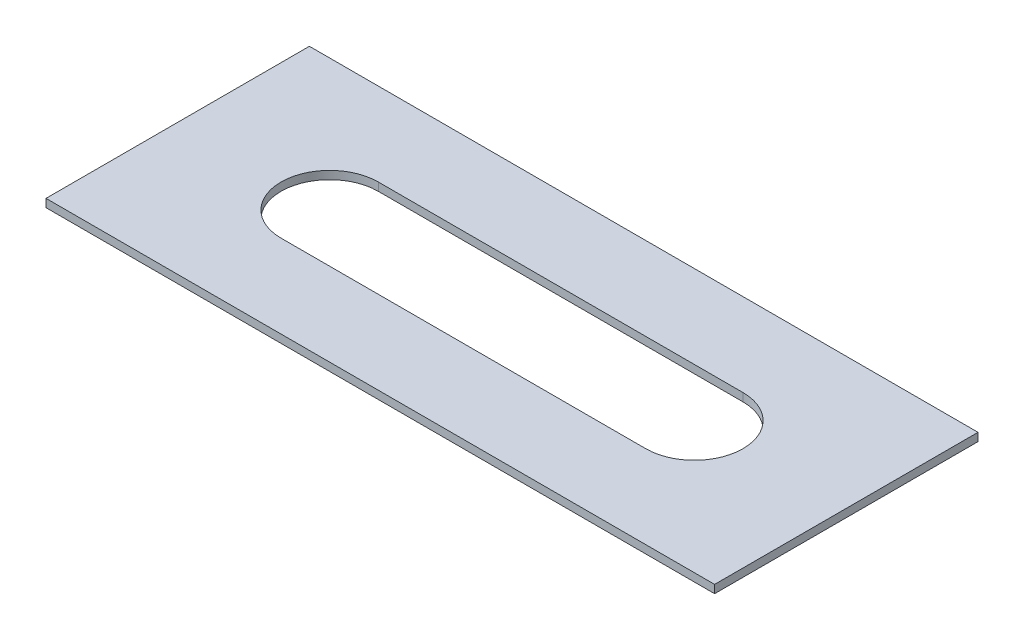
ISO-10303-21;
HEADER;
FILE_DESCRIPTION(('STEP AP214'),'2;1');
FILE_NAME('part.step','',(''),(''),'','','');
FILE_SCHEMA(('AUTOMOTIVE_DESIGN { 1 0 10303 214 1 1 1 1 }'));
ENDSEC;
DATA;
#1=APPLICATION_CONTEXT('core data for automotive mechanical design processes');
#2=APPLICATION_PROTOCOL_DEFINITION('international standard','automotive_design',2000,#1);
#3=PRODUCT_CONTEXT('',#1,'mechanical');
#4=PRODUCT('Part','Part','',(#3));
#5=PRODUCT_RELATED_PRODUCT_CATEGORY('part','',(#4));
#6=PRODUCT_DEFINITION_FORMATION('','',#4);
#7=PRODUCT_DEFINITION_CONTEXT('part definition',#1,'design');
#8=PRODUCT_DEFINITION('design','',#6,#7);
#9=PRODUCT_DEFINITION_SHAPE('','',#8);
#10=(LENGTH_UNIT() NAMED_UNIT(*) SI_UNIT(.MILLI.,.METRE.));
#11=(NAMED_UNIT(*) PLANE_ANGLE_UNIT() SI_UNIT($,.RADIAN.));
#12=(NAMED_UNIT(*) SI_UNIT($,.STERADIAN.) SOLID_ANGLE_UNIT());
#13=UNCERTAINTY_MEASURE_WITH_UNIT(LENGTH_MEASURE(1.E-05),#10,'distance_accuracy_value','');
#14=(GEOMETRIC_REPRESENTATION_CONTEXT(3) GLOBAL_UNCERTAINTY_ASSIGNED_CONTEXT((#13)) GLOBAL_UNIT_ASSIGNED_CONTEXT((#10,
#11,#12)) REPRESENTATION_CONTEXT('',''));
#15=CARTESIAN_POINT('',(0.,0.,0.));
#16=DIRECTION('',(0.,0.,1.));
#17=DIRECTION('',(1.,0.,0.));
#18=AXIS2_PLACEMENT_3D('',#15,#16,#17);
#19=CARTESIAN_POINT('',(0.,2.,0.));
#20=DIRECTION('',(0.,-1.,0.));
#21=DIRECTION('',(0.,0.,-1.));
#22=AXIS2_PLACEMENT_3D('',#19,#20,#21);
#23=PLANE('',#22);
#24=DIRECTION('',(0.,0.,1.));
#25=VECTOR('',#24,1.);
#26=CARTESIAN_POINT('',(0.,2.,0.));
#27=LINE('',#26,#25);
#28=CARTESIAN_POINT('',(0.,2.,-65.));
#29=VERTEX_POINT('',#28);
#30=CARTESIAN_POINT('',(0.,2.,0.));
#31=VERTEX_POINT('',#30);
#32=EDGE_CURVE('E138',#29,#31,#27,.T.);
#33=ORIENTED_EDGE('',*,*,#32,.T.);
#34=DIRECTION('',(1.,0.,0.));
#35=VECTOR('',#34,1.);
#36=CARTESIAN_POINT('',(0.,2.,0.));
#37=LINE('',#36,#35);
#38=CARTESIAN_POINT('',(165.,2.,0.));
#39=VERTEX_POINT('',#38);
#40=EDGE_CURVE('E141',#31,#39,#37,.T.);
#41=ORIENTED_EDGE('',*,*,#40,.T.);
#42=DIRECTION('',(0.,0.,-1.));
#43=VECTOR('',#42,1.);
#44=CARTESIAN_POINT('',(165.,2.,0.));
#45=LINE('',#44,#43);
#46=CARTESIAN_POINT('',(165.,2.,-65.));
#47=VERTEX_POINT('',#46);
#48=EDGE_CURVE('E144',#39,#47,#45,.T.);
#49=ORIENTED_EDGE('',*,*,#48,.T.);
#50=DIRECTION('',(-1.,0.,0.));
#51=VECTOR('',#50,1.);
#52=CARTESIAN_POINT('',(0.,2.,-65.));
#53=LINE('',#52,#51);
#54=EDGE_CURVE('E146',#47,#29,#53,.T.);
#55=ORIENTED_EDGE('',*,*,#54,.T.);
#56=EDGE_LOOP('',(#33,#41,#49,#55));
#57=FACE_BOUND('',#56,.T.);
#58=CARTESIAN_POINT('',(37.5,2.,-32.5));
#59=DIRECTION('',(0.,1.,0.));
#60=DIRECTION('',(0.,0.,1.));
#61=AXIS2_PLACEMENT_3D('',#58,#59,#60);
#62=CIRCLE('',#61,12.);
#63=CARTESIAN_POINT('',(37.5,2.,-44.5));
#64=VERTEX_POINT('',#63);
#65=CARTESIAN_POINT('',(37.5,2.,-20.5));
#66=VERTEX_POINT('',#65);
#67=EDGE_CURVE('E102',#64,#66,#62,.T.);
#68=ORIENTED_EDGE('',*,*,#67,.F.);
#69=DIRECTION('',(-1.,0.,0.));
#70=VECTOR('',#69,1.);
#71=CARTESIAN_POINT('',(37.5,2.,-44.5));
#72=LINE('',#71,#70);
#73=CARTESIAN_POINT('',(127.5,2.,-44.5));
#74=VERTEX_POINT('',#73);
#75=EDGE_CURVE('E124',#74,#64,#72,.T.);
#76=ORIENTED_EDGE('',*,*,#75,.F.);
#77=CARTESIAN_POINT('',(127.5,2.,-32.5));
#78=DIRECTION('',(0.,1.,0.));
#79=DIRECTION('',(0.,0.,1.));
#80=AXIS2_PLACEMENT_3D('',#77,#78,#79);
#81=CIRCLE('',#80,12.);
#82=CARTESIAN_POINT('',(127.5,2.,-20.5));
#83=VERTEX_POINT('',#82);
#84=EDGE_CURVE('E122',#83,#74,#81,.T.);
#85=ORIENTED_EDGE('',*,*,#84,.F.);
#86=DIRECTION('',(1.,0.,0.));
#87=VECTOR('',#86,1.);
#88=CARTESIAN_POINT('',(37.5,2.,-20.5));
#89=LINE('',#88,#87);
#90=EDGE_CURVE('E110',#66,#83,#89,.T.);
#91=ORIENTED_EDGE('',*,*,#90,.F.);
#92=EDGE_LOOP('',(#68,#76,#85,#91));
#93=FACE_BOUND('',#92,.T.);
#94=ADVANCED_FACE('F37',(#57,#93),#23,.F.);
#95=CARTESIAN_POINT('',(0.,0.,0.));
#96=DIRECTION('',(0.,-1.,0.));
#97=DIRECTION('',(0.,0.,-1.));
#98=AXIS2_PLACEMENT_3D('',#95,#96,#97);
#99=PLANE('',#98);
#100=DIRECTION('',(0.,0.,1.));
#101=VECTOR('',#100,1.);
#102=CARTESIAN_POINT('',(0.,0.,0.));
#103=LINE('',#102,#101);
#104=CARTESIAN_POINT('',(0.,0.,-65.));
#105=VERTEX_POINT('',#104);
#106=CARTESIAN_POINT('',(0.,0.,0.));
#107=VERTEX_POINT('',#106);
#108=EDGE_CURVE('E118',#105,#107,#103,.T.);
#109=ORIENTED_EDGE('',*,*,#108,.F.);
#110=DIRECTION('',(-1.,0.,0.));
#111=VECTOR('',#110,1.);
#112=CARTESIAN_POINT('',(0.,0.,-65.));
#113=LINE('',#112,#111);
#114=CARTESIAN_POINT('',(165.,0.,-65.));
#115=VERTEX_POINT('',#114);
#116=EDGE_CURVE('E142',#115,#105,#113,.T.);
#117=ORIENTED_EDGE('',*,*,#116,.F.);
#118=DIRECTION('',(0.,0.,-1.));
#119=VECTOR('',#118,1.);
#120=CARTESIAN_POINT('',(165.,0.,0.));
#121=LINE('',#120,#119);
#122=CARTESIAN_POINT('',(165.,0.,0.));
#123=VERTEX_POINT('',#122);
#124=EDGE_CURVE('E153',#123,#115,#121,.T.);
#125=ORIENTED_EDGE('',*,*,#124,.F.);
#126=DIRECTION('',(1.,0.,0.));
#127=VECTOR('',#126,1.);
#128=CARTESIAN_POINT('',(0.,0.,0.));
#129=LINE('',#128,#127);
#130=EDGE_CURVE('E151',#107,#123,#129,.T.);
#131=ORIENTED_EDGE('',*,*,#130,.F.);
#132=EDGE_LOOP('',(#109,#117,#125,#131));
#133=FACE_BOUND('',#132,.T.);
#134=DIRECTION('',(-1.,0.,0.));
#135=VECTOR('',#134,1.);
#136=CARTESIAN_POINT('',(37.5,0.,-44.5));
#137=LINE('',#136,#135);
#138=CARTESIAN_POINT('',(127.5,0.,-44.5));
#139=VERTEX_POINT('',#138);
#140=CARTESIAN_POINT('',(37.5,0.,-44.5));
#141=VERTEX_POINT('',#140);
#142=EDGE_CURVE('E111',#139,#141,#137,.T.);
#143=ORIENTED_EDGE('',*,*,#142,.T.);
#144=CARTESIAN_POINT('',(37.5,0.,-32.5));
#145=DIRECTION('',(0.,1.,0.));
#146=DIRECTION('',(0.,0.,1.));
#147=AXIS2_PLACEMENT_3D('',#144,#145,#146);
#148=CIRCLE('',#147,12.);
#149=CARTESIAN_POINT('',(37.5,0.,-20.5));
#150=VERTEX_POINT('',#149);
#151=EDGE_CURVE('E60',#141,#150,#148,.T.);
#152=ORIENTED_EDGE('',*,*,#151,.T.);
#153=DIRECTION('',(1.,0.,0.));
#154=VECTOR('',#153,1.);
#155=CARTESIAN_POINT('',(37.5,0.,-20.5));
#156=LINE('',#155,#154);
#157=CARTESIAN_POINT('',(127.5,0.,-20.5));
#158=VERTEX_POINT('',#157);
#159=EDGE_CURVE('E117',#150,#158,#156,.T.);
#160=ORIENTED_EDGE('',*,*,#159,.T.);
#161=CARTESIAN_POINT('',(127.5,0.,-32.5));
#162=DIRECTION('',(0.,1.,0.));
#163=DIRECTION('',(0.,0.,1.));
#164=AXIS2_PLACEMENT_3D('',#161,#162,#163);
#165=CIRCLE('',#164,12.);
#166=EDGE_CURVE('E130',#158,#139,#165,.T.);
#167=ORIENTED_EDGE('',*,*,#166,.T.);
#168=EDGE_LOOP('',(#143,#152,#160,#167));
#169=FACE_BOUND('',#168,.T.);
#170=ADVANCED_FACE('F171',(#133,#169),#99,.T.);
#171=CARTESIAN_POINT('',(0.,2.,0.));
#172=DIRECTION('',(1.,0.,0.));
#173=DIRECTION('',(0.,0.,-1.));
#174=AXIS2_PLACEMENT_3D('',#171,#172,#173);
#175=PLANE('',#174);
#176=ORIENTED_EDGE('',*,*,#108,.T.);
#177=DIRECTION('',(0.,-1.,0.));
#178=VECTOR('',#177,1.);
#179=CARTESIAN_POINT('',(0.,2.,0.));
#180=LINE('',#179,#178);
#181=EDGE_CURVE('E11',#31,#107,#180,.T.);
#182=ORIENTED_EDGE('',*,*,#181,.F.);
#183=ORIENTED_EDGE('',*,*,#32,.F.);
#184=DIRECTION('',(0.,-1.,0.));
#185=VECTOR('',#184,1.);
#186=CARTESIAN_POINT('',(0.,2.,-65.));
#187=LINE('',#186,#185);
#188=EDGE_CURVE('E148',#29,#105,#187,.T.);
#189=ORIENTED_EDGE('',*,*,#188,.T.);
#190=EDGE_LOOP('',(#176,#182,#183,#189));
#191=FACE_BOUND('',#190,.T.);
#192=ADVANCED_FACE('F39',(#191),#175,.F.);
#193=CARTESIAN_POINT('',(0.,2.,0.));
#194=DIRECTION('',(0.,0.,-1.));
#195=DIRECTION('',(-1.,0.,0.));
#196=AXIS2_PLACEMENT_3D('',#193,#194,#195);
#197=PLANE('',#196);
#198=ORIENTED_EDGE('',*,*,#130,.T.);
#199=DIRECTION('',(0.,-1.,0.));
#200=VECTOR('',#199,1.);
#201=CARTESIAN_POINT('',(165.,2.,0.));
#202=LINE('',#201,#200);
#203=EDGE_CURVE('E45',#39,#123,#202,.T.);
#204=ORIENTED_EDGE('',*,*,#203,.F.);
#205=ORIENTED_EDGE('',*,*,#40,.F.);
#206=ORIENTED_EDGE('',*,*,#181,.T.);
#207=EDGE_LOOP('',(#198,#204,#205,#206));
#208=FACE_BOUND('',#207,.T.);
#209=ADVANCED_FACE('F181',(#208),#197,.F.);
#210=CARTESIAN_POINT('',(165.,2.,0.));
#211=DIRECTION('',(-1.,0.,0.));
#212=DIRECTION('',(0.,0.,1.));
#213=AXIS2_PLACEMENT_3D('',#210,#211,#212);
#214=PLANE('',#213);
#215=ORIENTED_EDGE('',*,*,#124,.T.);
#216=DIRECTION('',(0.,-1.,0.));
#217=VECTOR('',#216,1.);
#218=CARTESIAN_POINT('',(165.,2.,-65.));
#219=LINE('',#218,#217);
#220=EDGE_CURVE('E158',#47,#115,#219,.T.);
#221=ORIENTED_EDGE('',*,*,#220,.F.);
#222=ORIENTED_EDGE('',*,*,#48,.F.);
#223=ORIENTED_EDGE('',*,*,#203,.T.);
#224=EDGE_LOOP('',(#215,#221,#222,#223));
#225=FACE_BOUND('',#224,.T.);
#226=ADVANCED_FACE('F165',(#225),#214,.F.);
#227=CARTESIAN_POINT('',(0.,2.,-65.));
#228=DIRECTION('',(0.,0.,1.));
#229=DIRECTION('',(1.,0.,0.));
#230=AXIS2_PLACEMENT_3D('',#227,#228,#229);
#231=PLANE('',#230);
#232=ORIENTED_EDGE('',*,*,#116,.T.);
#233=ORIENTED_EDGE('',*,*,#188,.F.);
#234=ORIENTED_EDGE('',*,*,#54,.F.);
#235=ORIENTED_EDGE('',*,*,#220,.T.);
#236=EDGE_LOOP('',(#232,#233,#234,#235));
#237=FACE_BOUND('',#236,.T.);
#238=ADVANCED_FACE('F175',(#237),#231,.F.);
#239=CARTESIAN_POINT('',(37.5,2.,-32.5));
#240=DIRECTION('',(0.,-1.,0.));
#241=DIRECTION('',(0.,0.,-1.));
#242=AXIS2_PLACEMENT_3D('',#239,#240,#241);
#243=CYLINDRICAL_SURFACE('',#242,12.);
#244=ORIENTED_EDGE('',*,*,#151,.F.);
#245=DIRECTION('',(0.,-1.,0.));
#246=VECTOR('',#245,1.);
#247=CARTESIAN_POINT('',(37.5,2.,-44.5));
#248=LINE('',#247,#246);
#249=EDGE_CURVE('E106',#64,#141,#248,.T.);
#250=ORIENTED_EDGE('',*,*,#249,.F.);
#251=ORIENTED_EDGE('',*,*,#67,.T.);
#252=DIRECTION('',(0.,-1.,0.));
#253=VECTOR('',#252,1.);
#254=CARTESIAN_POINT('',(37.5,2.,-20.5));
#255=LINE('',#254,#253);
#256=EDGE_CURVE('E105',#66,#150,#255,.T.);
#257=ORIENTED_EDGE('',*,*,#256,.T.);
#258=EDGE_LOOP('',(#244,#250,#251,#257));
#259=FACE_BOUND('',#258,.T.);
#260=ADVANCED_FACE('F104',(#259),#243,.F.);
#261=CARTESIAN_POINT('',(37.5,2.,-20.5));
#262=DIRECTION('',(0.,0.,-1.));
#263=DIRECTION('',(-1.,0.,0.));
#264=AXIS2_PLACEMENT_3D('',#261,#262,#263);
#265=PLANE('',#264);
#266=ORIENTED_EDGE('',*,*,#159,.F.);
#267=ORIENTED_EDGE('',*,*,#256,.F.);
#268=ORIENTED_EDGE('',*,*,#90,.T.);
#269=DIRECTION('',(0.,-1.,0.));
#270=VECTOR('',#269,1.);
#271=CARTESIAN_POINT('',(127.5,2.,-20.5));
#272=LINE('',#271,#270);
#273=EDGE_CURVE('E119',#83,#158,#272,.T.);
#274=ORIENTED_EDGE('',*,*,#273,.T.);
#275=EDGE_LOOP('',(#266,#267,#268,#274));
#276=FACE_BOUND('',#275,.T.);
#277=ADVANCED_FACE('F114',(#276),#265,.T.);
#278=CARTESIAN_POINT('',(127.5,2.,-32.5));
#279=DIRECTION('',(0.,-1.,0.));
#280=DIRECTION('',(0.,0.,-1.));
#281=AXIS2_PLACEMENT_3D('',#278,#279,#280);
#282=CYLINDRICAL_SURFACE('',#281,12.);
#283=ORIENTED_EDGE('',*,*,#166,.F.);
#284=ORIENTED_EDGE('',*,*,#273,.F.);
#285=ORIENTED_EDGE('',*,*,#84,.T.);
#286=DIRECTION('',(0.,-1.,0.));
#287=VECTOR('',#286,1.);
#288=CARTESIAN_POINT('',(127.5,2.,-44.5));
#289=LINE('',#288,#287);
#290=EDGE_CURVE('E52',#74,#139,#289,.T.);
#291=ORIENTED_EDGE('',*,*,#290,.T.);
#292=EDGE_LOOP('',(#283,#284,#285,#291));
#293=FACE_BOUND('',#292,.T.);
#294=ADVANCED_FACE('F204',(#293),#282,.F.);
#295=CARTESIAN_POINT('',(37.5,2.,-44.5));
#296=DIRECTION('',(0.,0.,1.));
#297=DIRECTION('',(1.,0.,0.));
#298=AXIS2_PLACEMENT_3D('',#295,#296,#297);
#299=PLANE('',#298);
#300=ORIENTED_EDGE('',*,*,#142,.F.);
#301=ORIENTED_EDGE('',*,*,#290,.F.);
#302=ORIENTED_EDGE('',*,*,#75,.T.);
#303=ORIENTED_EDGE('',*,*,#249,.T.);
#304=EDGE_LOOP('',(#300,#301,#302,#303));
#305=FACE_BOUND('',#304,.T.);
#306=ADVANCED_FACE('F208',(#305),#299,.T.);
#307=CLOSED_SHELL('',(#94,#170,#192,#209,#226,#238,#260,#277,#294,#306));
#308=MANIFOLD_SOLID_BREP('B2',#307);
#309=ADVANCED_BREP_SHAPE_REPRESENTATION('',(#18,#308),#14);
#310=SHAPE_DEFINITION_REPRESENTATION(#9,#309);
ENDSEC;
END-ISO-10303-21;
